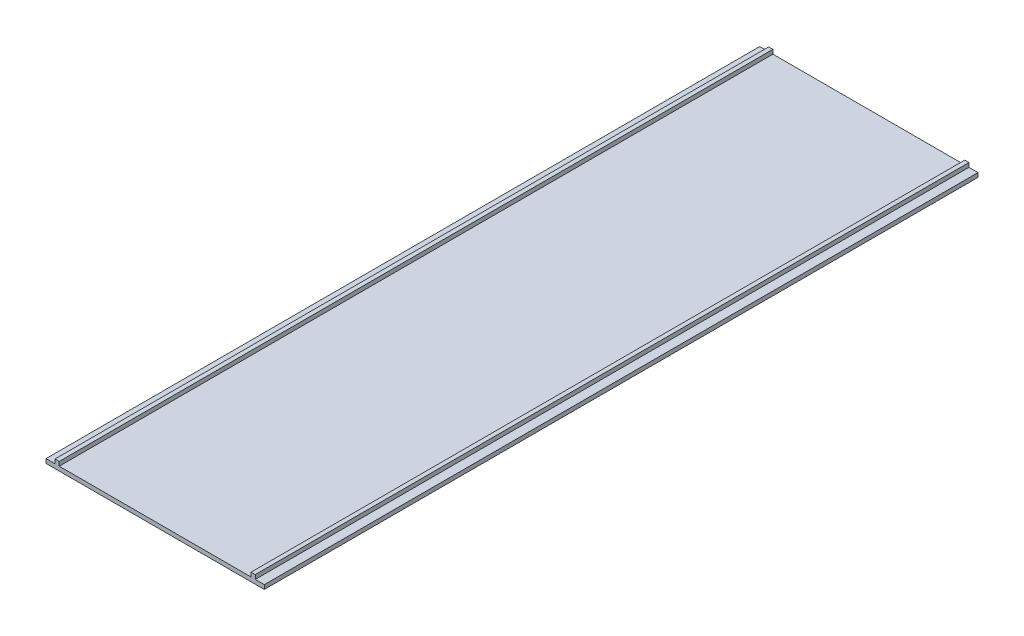
ISO-10303-21;
HEADER;
FILE_DESCRIPTION(('STEP AP214'),'2;1');
FILE_NAME('part.step','',(''),(''),'','','');
FILE_SCHEMA(('AUTOMOTIVE_DESIGN { 1 0 10303 214 1 1 1 1 }'));
ENDSEC;
DATA;
#1=APPLICATION_CONTEXT('core data for automotive mechanical design processes');
#2=APPLICATION_PROTOCOL_DEFINITION('international standard','automotive_design',2000,#1);
#3=PRODUCT_CONTEXT('',#1,'mechanical');
#4=PRODUCT('Part','Part','',(#3));
#5=PRODUCT_RELATED_PRODUCT_CATEGORY('part','',(#4));
#6=PRODUCT_DEFINITION_FORMATION('','',#4);
#7=PRODUCT_DEFINITION_CONTEXT('part definition',#1,'design');
#8=PRODUCT_DEFINITION('design','',#6,#7);
#9=PRODUCT_DEFINITION_SHAPE('','',#8);
#10=(LENGTH_UNIT() NAMED_UNIT(*) SI_UNIT(.MILLI.,.METRE.));
#11=(NAMED_UNIT(*) PLANE_ANGLE_UNIT() SI_UNIT($,.RADIAN.));
#12=(NAMED_UNIT(*) SI_UNIT($,.STERADIAN.) SOLID_ANGLE_UNIT());
#13=UNCERTAINTY_MEASURE_WITH_UNIT(LENGTH_MEASURE(1.E-05),#10,'distance_accuracy_value','');
#14=(GEOMETRIC_REPRESENTATION_CONTEXT(3) GLOBAL_UNCERTAINTY_ASSIGNED_CONTEXT((#13)) GLOBAL_UNIT_ASSIGNED_CONTEXT((#10,
#11,#12)) REPRESENTATION_CONTEXT('',''));
#15=CARTESIAN_POINT('',(0.,0.,0.));
#16=DIRECTION('',(0.,0.,1.));
#17=DIRECTION('',(1.,0.,0.));
#18=AXIS2_PLACEMENT_3D('',#15,#16,#17);
#19=CARTESIAN_POINT('',(0.,2.,0.));
#20=DIRECTION('',(0.,-1.,0.));
#21=DIRECTION('',(0.,0.,-1.));
#22=AXIS2_PLACEMENT_3D('',#19,#20,#21);
#23=PLANE('',#22);
#24=DIRECTION('',(0.,0.,1.));
#25=VECTOR('',#24,1.);
#26=CARTESIAN_POINT('',(47.7,2.,-172.828427124746));
#27=LINE('',#26,#25);
#28=CARTESIAN_POINT('',(47.7,2.,-170.));
#29=VERTEX_POINT('',#28);
#30=CARTESIAN_POINT('',(47.7,2.,170.));
#31=VERTEX_POINT('',#30);
#32=EDGE_CURVE('E50',#29,#31,#27,.T.);
#33=ORIENTED_EDGE('',*,*,#32,.T.);
#34=DIRECTION('',(1.,0.,0.));
#35=VECTOR('',#34,1.);
#36=CARTESIAN_POINT('',(-52.,2.,170.));
#37=LINE('',#36,#35);
#38=CARTESIAN_POINT('',(52.,2.,170.));
#39=VERTEX_POINT('',#38);
#40=EDGE_CURVE('E148',#31,#39,#37,.T.);
#41=ORIENTED_EDGE('',*,*,#40,.T.);
#42=DIRECTION('',(0.,0.,-1.));
#43=VECTOR('',#42,1.);
#44=CARTESIAN_POINT('',(52.,2.,170.));
#45=LINE('',#44,#43);
#46=CARTESIAN_POINT('',(52.,2.,-170.));
#47=VERTEX_POINT('',#46);
#48=EDGE_CURVE('E187',#39,#47,#45,.T.);
#49=ORIENTED_EDGE('',*,*,#48,.T.);
#50=DIRECTION('',(-1.,0.,0.));
#51=VECTOR('',#50,1.);
#52=CARTESIAN_POINT('',(-52.,2.,-170.));
#53=LINE('',#52,#51);
#54=EDGE_CURVE('E192',#47,#29,#53,.T.);
#55=ORIENTED_EDGE('',*,*,#54,.T.);
#56=EDGE_LOOP('',(#33,#41,#49,#55));
#57=FACE_BOUND('',#56,.T.);
#58=ADVANCED_FACE('F35',(#57),#23,.F.);
#59=DIRECTION('',(0.,0.,1.));
#60=VECTOR('',#59,1.);
#61=CARTESIAN_POINT('',(45.7,2.,-172.828427124746));
#62=LINE('',#61,#60);
#63=CARTESIAN_POINT('',(45.7,2.,-170.));
#64=VERTEX_POINT('',#63);
#65=CARTESIAN_POINT('',(45.7,2.,170.));
#66=VERTEX_POINT('',#65);
#67=EDGE_CURVE('E155',#64,#66,#62,.T.);
#68=ORIENTED_EDGE('',*,*,#67,.F.);
#69=CARTESIAN_POINT('',(-45.7,2.,-170.));
#70=VERTEX_POINT('',#69);
#71=EDGE_CURVE('E195',#64,#70,#53,.T.);
#72=ORIENTED_EDGE('',*,*,#71,.T.);
#73=DIRECTION('',(0.,0.,1.));
#74=VECTOR('',#73,1.);
#75=CARTESIAN_POINT('',(-45.7,2.,-172.828427124746));
#76=LINE('',#75,#74);
#77=CARTESIAN_POINT('',(-45.7,2.,170.));
#78=VERTEX_POINT('',#77);
#79=EDGE_CURVE('E176',#70,#78,#76,.T.);
#80=ORIENTED_EDGE('',*,*,#79,.T.);
#81=EDGE_CURVE('E58',#78,#66,#37,.T.);
#82=ORIENTED_EDGE('',*,*,#81,.T.);
#83=EDGE_LOOP('',(#68,#72,#80,#82));
#84=FACE_BOUND('',#83,.T.);
#85=ADVANCED_FACE('F249',(#84),#23,.F.);
#86=DIRECTION('',(0.,0.,1.));
#87=VECTOR('',#86,1.);
#88=CARTESIAN_POINT('',(-47.7,2.,-172.828427124746));
#89=LINE('',#88,#87);
#90=CARTESIAN_POINT('',(-47.7,2.,-170.));
#91=VERTEX_POINT('',#90);
#92=CARTESIAN_POINT('',(-47.7,2.,170.));
#93=VERTEX_POINT('',#92);
#94=EDGE_CURVE('E164',#91,#93,#89,.T.);
#95=ORIENTED_EDGE('',*,*,#94,.F.);
#96=CARTESIAN_POINT('',(-52.,2.,-170.));
#97=VERTEX_POINT('',#96);
#98=EDGE_CURVE('E190',#91,#97,#53,.T.);
#99=ORIENTED_EDGE('',*,*,#98,.T.);
#100=DIRECTION('',(0.,0.,1.));
#101=VECTOR('',#100,1.);
#102=CARTESIAN_POINT('',(-52.,2.,170.));
#103=LINE('',#102,#101);
#104=CARTESIAN_POINT('',(-52.,2.,170.));
#105=VERTEX_POINT('',#104);
#106=EDGE_CURVE('E194',#97,#105,#103,.T.);
#107=ORIENTED_EDGE('',*,*,#106,.T.);
#108=EDGE_CURVE('E197',#105,#93,#37,.T.);
#109=ORIENTED_EDGE('',*,*,#108,.T.);
#110=EDGE_LOOP('',(#95,#99,#107,#109));
#111=FACE_BOUND('',#110,.T.);
#112=ADVANCED_FACE('F248',(#111),#23,.F.);
#113=CARTESIAN_POINT('',(52.,2.,170.));
#114=DIRECTION('',(-1.,0.,0.));
#115=DIRECTION('',(0.,0.,1.));
#116=AXIS2_PLACEMENT_3D('',#113,#114,#115);
#117=PLANE('',#116);
#118=DIRECTION('',(0.,0.,-1.));
#119=VECTOR('',#118,1.);
#120=CARTESIAN_POINT('',(52.,0.,170.));
#121=LINE('',#120,#119);
#122=CARTESIAN_POINT('',(52.,0.,170.));
#123=VERTEX_POINT('',#122);
#124=CARTESIAN_POINT('',(52.,0.,-170.));
#125=VERTEX_POINT('',#124);
#126=EDGE_CURVE('E186',#123,#125,#121,.T.);
#127=ORIENTED_EDGE('',*,*,#126,.T.);
#128=DIRECTION('',(0.,-1.,0.));
#129=VECTOR('',#128,1.);
#130=CARTESIAN_POINT('',(52.,2.,-170.));
#131=LINE('',#130,#129);
#132=EDGE_CURVE('E11',#47,#125,#131,.T.);
#133=ORIENTED_EDGE('',*,*,#132,.F.);
#134=ORIENTED_EDGE('',*,*,#48,.F.);
#135=DIRECTION('',(0.,-1.,0.));
#136=VECTOR('',#135,1.);
#137=CARTESIAN_POINT('',(52.,2.,170.));
#138=LINE('',#137,#136);
#139=EDGE_CURVE('E199',#39,#123,#138,.T.);
#140=ORIENTED_EDGE('',*,*,#139,.T.);
#141=EDGE_LOOP('',(#127,#133,#134,#140));
#142=FACE_BOUND('',#141,.T.);
#143=ADVANCED_FACE('F37',(#142),#117,.F.);
#144=CARTESIAN_POINT('',(-52.,2.,-170.));
#145=DIRECTION('',(0.,0.,1.));
#146=DIRECTION('',(1.,0.,0.));
#147=AXIS2_PLACEMENT_3D('',#144,#145,#146);
#148=PLANE('',#147);
#149=DIRECTION('',(-1.,0.,0.));
#150=VECTOR('',#149,1.);
#151=CARTESIAN_POINT('',(-52.,0.,-170.));
#152=LINE('',#151,#150);
#153=CARTESIAN_POINT('',(-52.,0.,-170.));
#154=VERTEX_POINT('',#153);
#155=EDGE_CURVE('E202',#125,#154,#152,.T.);
#156=ORIENTED_EDGE('',*,*,#155,.T.);
#157=DIRECTION('',(0.,-1.,0.));
#158=VECTOR('',#157,1.);
#159=CARTESIAN_POINT('',(-52.,2.,-170.));
#160=LINE('',#159,#158);
#161=EDGE_CURVE('E43',#97,#154,#160,.T.);
#162=ORIENTED_EDGE('',*,*,#161,.F.);
#163=ORIENTED_EDGE('',*,*,#98,.F.);
#164=DIRECTION('',(0.,1.,0.));
#165=VECTOR('',#164,1.);
#166=CARTESIAN_POINT('',(-47.7,2.,-170.));
#167=LINE('',#166,#165);
#168=CARTESIAN_POINT('',(-47.7,4.,-170.));
#169=VERTEX_POINT('',#168);
#170=EDGE_CURVE('E163',#91,#169,#167,.T.);
#171=ORIENTED_EDGE('',*,*,#170,.T.);
#172=DIRECTION('',(1.,0.,0.));
#173=VECTOR('',#172,1.);
#174=CARTESIAN_POINT('',(-47.7,4.,-170.));
#175=LINE('',#174,#173);
#176=CARTESIAN_POINT('',(-45.7,4.,-170.));
#177=VERTEX_POINT('',#176);
#178=EDGE_CURVE('E161',#169,#177,#175,.T.);
#179=ORIENTED_EDGE('',*,*,#178,.T.);
#180=DIRECTION('',(0.,-1.,0.));
#181=VECTOR('',#180,1.);
#182=CARTESIAN_POINT('',(-45.7,4.,-170.));
#183=LINE('',#182,#181);
#184=EDGE_CURVE('E166',#177,#70,#183,.T.);
#185=ORIENTED_EDGE('',*,*,#184,.T.);
#186=ORIENTED_EDGE('',*,*,#71,.F.);
#187=DIRECTION('',(0.,-1.,0.));
#188=VECTOR('',#187,1.);
#189=CARTESIAN_POINT('',(45.7,4.,-170.));
#190=LINE('',#189,#188);
#191=CARTESIAN_POINT('',(45.7,4.,-170.));
#192=VERTEX_POINT('',#191);
#193=EDGE_CURVE('E151',#192,#64,#190,.T.);
#194=ORIENTED_EDGE('',*,*,#193,.F.);
#195=DIRECTION('',(-1.,0.,0.));
#196=VECTOR('',#195,1.);
#197=CARTESIAN_POINT('',(47.7,4.,-170.));
#198=LINE('',#197,#196);
#199=CARTESIAN_POINT('',(47.7,4.,-170.));
#200=VERTEX_POINT('',#199);
#201=EDGE_CURVE('E160',#200,#192,#198,.T.);
#202=ORIENTED_EDGE('',*,*,#201,.F.);
#203=DIRECTION('',(0.,1.,0.));
#204=VECTOR('',#203,1.);
#205=CARTESIAN_POINT('',(47.7,2.,-170.));
#206=LINE('',#205,#204);
#207=EDGE_CURVE('E132',#29,#200,#206,.T.);
#208=ORIENTED_EDGE('',*,*,#207,.F.);
#209=ORIENTED_EDGE('',*,*,#54,.F.);
#210=ORIENTED_EDGE('',*,*,#132,.T.);
#211=EDGE_LOOP('',(#156,#162,#163,#171,#179,#185,#186,#194,#202,#208,#209,#210));
#212=FACE_BOUND('',#211,.T.);
#213=ADVANCED_FACE('F228',(#212),#148,.F.);
#214=CARTESIAN_POINT('',(-52.,2.,170.));
#215=DIRECTION('',(1.,0.,0.));
#216=DIRECTION('',(0.,0.,-1.));
#217=AXIS2_PLACEMENT_3D('',#214,#215,#216);
#218=PLANE('',#217);
#219=DIRECTION('',(0.,0.,1.));
#220=VECTOR('',#219,1.);
#221=CARTESIAN_POINT('',(-52.,0.,170.));
#222=LINE('',#221,#220);
#223=CARTESIAN_POINT('',(-52.,0.,170.));
#224=VERTEX_POINT('',#223);
#225=EDGE_CURVE('E204',#154,#224,#222,.T.);
#226=ORIENTED_EDGE('',*,*,#225,.T.);
#227=DIRECTION('',(0.,-1.,0.));
#228=VECTOR('',#227,1.);
#229=CARTESIAN_POINT('',(-52.,2.,170.));
#230=LINE('',#229,#228);
#231=EDGE_CURVE('E209',#105,#224,#230,.T.);
#232=ORIENTED_EDGE('',*,*,#231,.F.);
#233=ORIENTED_EDGE('',*,*,#106,.F.);
#234=ORIENTED_EDGE('',*,*,#161,.T.);
#235=EDGE_LOOP('',(#226,#232,#233,#234));
#236=FACE_BOUND('',#235,.T.);
#237=ADVANCED_FACE('F216',(#236),#218,.F.);
#238=CARTESIAN_POINT('',(-52.,2.,170.));
#239=DIRECTION('',(0.,0.,-1.));
#240=DIRECTION('',(-1.,0.,0.));
#241=AXIS2_PLACEMENT_3D('',#238,#239,#240);
#242=PLANE('',#241);
#243=DIRECTION('',(1.,0.,0.));
#244=VECTOR('',#243,1.);
#245=CARTESIAN_POINT('',(-52.,0.,170.));
#246=LINE('',#245,#244);
#247=EDGE_CURVE('E191',#224,#123,#246,.T.);
#248=ORIENTED_EDGE('',*,*,#247,.T.);
#249=ORIENTED_EDGE('',*,*,#139,.F.);
#250=ORIENTED_EDGE('',*,*,#40,.F.);
#251=DIRECTION('',(0.,-1.,0.));
#252=VECTOR('',#251,1.);
#253=CARTESIAN_POINT('',(47.7,2.,170.));
#254=LINE('',#253,#252);
#255=CARTESIAN_POINT('',(47.7,4.,170.));
#256=VERTEX_POINT('',#255);
#257=EDGE_CURVE('E130',#256,#31,#254,.T.);
#258=ORIENTED_EDGE('',*,*,#257,.F.);
#259=DIRECTION('',(1.,0.,0.));
#260=VECTOR('',#259,1.);
#261=CARTESIAN_POINT('',(47.7,4.,170.));
#262=LINE('',#261,#260);
#263=CARTESIAN_POINT('',(45.7,4.,170.));
#264=VERTEX_POINT('',#263);
#265=EDGE_CURVE('E138',#264,#256,#262,.T.);
#266=ORIENTED_EDGE('',*,*,#265,.F.);
#267=DIRECTION('',(0.,1.,0.));
#268=VECTOR('',#267,1.);
#269=CARTESIAN_POINT('',(45.7,4.,170.));
#270=LINE('',#269,#268);
#271=EDGE_CURVE('E144',#66,#264,#270,.T.);
#272=ORIENTED_EDGE('',*,*,#271,.F.);
#273=ORIENTED_EDGE('',*,*,#81,.F.);
#274=DIRECTION('',(0.,1.,0.));
#275=VECTOR('',#274,1.);
#276=CARTESIAN_POINT('',(-45.7,4.,170.));
#277=LINE('',#276,#275);
#278=CARTESIAN_POINT('',(-45.7,4.,170.));
#279=VERTEX_POINT('',#278);
#280=EDGE_CURVE('E167',#78,#279,#277,.T.);
#281=ORIENTED_EDGE('',*,*,#280,.T.);
#282=DIRECTION('',(-1.,0.,0.));
#283=VECTOR('',#282,1.);
#284=CARTESIAN_POINT('',(-47.7,4.,170.));
#285=LINE('',#284,#283);
#286=CARTESIAN_POINT('',(-47.7,4.,170.));
#287=VERTEX_POINT('',#286);
#288=EDGE_CURVE('E170',#279,#287,#285,.T.);
#289=ORIENTED_EDGE('',*,*,#288,.T.);
#290=DIRECTION('',(0.,-1.,0.));
#291=VECTOR('',#290,1.);
#292=CARTESIAN_POINT('',(-47.7,2.,170.));
#293=LINE('',#292,#291);
#294=EDGE_CURVE('E173',#287,#93,#293,.T.);
#295=ORIENTED_EDGE('',*,*,#294,.T.);
#296=ORIENTED_EDGE('',*,*,#108,.F.);
#297=ORIENTED_EDGE('',*,*,#231,.T.);
#298=EDGE_LOOP('',(#248,#249,#250,#258,#266,#272,#273,#281,#289,#295,#296,#297));
#299=FACE_BOUND('',#298,.T.);
#300=ADVANCED_FACE('F146',(#299),#242,.F.);
#301=CARTESIAN_POINT('',(0.,0.,0.));
#302=DIRECTION('',(0.,-1.,0.));
#303=DIRECTION('',(0.,0.,-1.));
#304=AXIS2_PLACEMENT_3D('',#301,#302,#303);
#305=PLANE('',#304);
#306=ORIENTED_EDGE('',*,*,#126,.F.);
#307=ORIENTED_EDGE('',*,*,#247,.F.);
#308=ORIENTED_EDGE('',*,*,#225,.F.);
#309=ORIENTED_EDGE('',*,*,#155,.F.);
#310=EDGE_LOOP('',(#306,#307,#308,#309));
#311=FACE_BOUND('',#310,.T.);
#312=ADVANCED_FACE('F223',(#311),#305,.T.);
#313=CARTESIAN_POINT('',(-47.7,2.,-172.828427124746));
#314=DIRECTION('',(-1.,0.,0.));
#315=DIRECTION('',(0.,0.,1.));
#316=AXIS2_PLACEMENT_3D('',#313,#314,#315);
#317=PLANE('',#316);
#318=ORIENTED_EDGE('',*,*,#170,.F.);
#319=ORIENTED_EDGE('',*,*,#94,.T.);
#320=ORIENTED_EDGE('',*,*,#294,.F.);
#321=DIRECTION('',(0.,0.,1.));
#322=VECTOR('',#321,1.);
#323=CARTESIAN_POINT('',(-47.7,4.,-172.828427124746));
#324=LINE('',#323,#322);
#325=EDGE_CURVE('E179',#169,#287,#324,.T.);
#326=ORIENTED_EDGE('',*,*,#325,.F.);
#327=EDGE_LOOP('',(#318,#319,#320,#326));
#328=FACE_BOUND('',#327,.T.);
#329=ADVANCED_FACE('F246',(#328),#317,.T.);
#330=CARTESIAN_POINT('',(-47.7,4.,-172.828427124746));
#331=DIRECTION('',(0.,1.,0.));
#332=DIRECTION('',(0.,0.,1.));
#333=AXIS2_PLACEMENT_3D('',#330,#331,#332);
#334=PLANE('',#333);
#335=ORIENTED_EDGE('',*,*,#178,.F.);
#336=ORIENTED_EDGE('',*,*,#325,.T.);
#337=ORIENTED_EDGE('',*,*,#288,.F.);
#338=DIRECTION('',(0.,0.,1.));
#339=VECTOR('',#338,1.);
#340=CARTESIAN_POINT('',(-45.7,4.,-172.828427124746));
#341=LINE('',#340,#339);
#342=EDGE_CURVE('E181',#177,#279,#341,.T.);
#343=ORIENTED_EDGE('',*,*,#342,.F.);
#344=EDGE_LOOP('',(#335,#336,#337,#343));
#345=FACE_BOUND('',#344,.T.);
#346=ADVANCED_FACE('F241',(#345),#334,.T.);
#347=CARTESIAN_POINT('',(-45.7,4.,-172.828427124746));
#348=DIRECTION('',(1.,0.,0.));
#349=DIRECTION('',(0.,0.,-1.));
#350=AXIS2_PLACEMENT_3D('',#347,#348,#349);
#351=PLANE('',#350);
#352=ORIENTED_EDGE('',*,*,#184,.F.);
#353=ORIENTED_EDGE('',*,*,#342,.T.);
#354=ORIENTED_EDGE('',*,*,#280,.F.);
#355=ORIENTED_EDGE('',*,*,#79,.F.);
#356=EDGE_LOOP('',(#352,#353,#354,#355));
#357=FACE_BOUND('',#356,.T.);
#358=ADVANCED_FACE('F236',(#357),#351,.T.);
#359=CARTESIAN_POINT('',(47.7,2.,-172.828427124746));
#360=DIRECTION('',(-1.,0.,0.));
#361=DIRECTION('',(0.,0.,1.));
#362=AXIS2_PLACEMENT_3D('',#359,#360,#361);
#363=PLANE('',#362);
#364=ORIENTED_EDGE('',*,*,#32,.F.);
#365=ORIENTED_EDGE('',*,*,#207,.T.);
#366=DIRECTION('',(0.,0.,1.));
#367=VECTOR('',#366,1.);
#368=CARTESIAN_POINT('',(47.7,4.,-172.828427124746));
#369=LINE('',#368,#367);
#370=EDGE_CURVE('E126',#200,#256,#369,.T.);
#371=ORIENTED_EDGE('',*,*,#370,.T.);
#372=ORIENTED_EDGE('',*,*,#257,.T.);
#373=EDGE_LOOP('',(#364,#365,#371,#372));
#374=FACE_BOUND('',#373,.T.);
#375=ADVANCED_FACE('F128',(#374),#363,.F.);
#376=CARTESIAN_POINT('',(47.7,4.,-172.828427124746));
#377=DIRECTION('',(0.,-1.,0.));
#378=DIRECTION('',(0.,0.,-1.));
#379=AXIS2_PLACEMENT_3D('',#376,#377,#378);
#380=PLANE('',#379);
#381=ORIENTED_EDGE('',*,*,#370,.F.);
#382=ORIENTED_EDGE('',*,*,#201,.T.);
#383=DIRECTION('',(0.,0.,1.));
#384=VECTOR('',#383,1.);
#385=CARTESIAN_POINT('',(45.7,4.,-172.828427124746));
#386=LINE('',#385,#384);
#387=EDGE_CURVE('E135',#192,#264,#386,.T.);
#388=ORIENTED_EDGE('',*,*,#387,.T.);
#389=ORIENTED_EDGE('',*,*,#265,.T.);
#390=EDGE_LOOP('',(#381,#382,#388,#389));
#391=FACE_BOUND('',#390,.T.);
#392=ADVANCED_FACE('F139',(#391),#380,.F.);
#393=CARTESIAN_POINT('',(45.7,4.,-172.828427124746));
#394=DIRECTION('',(1.,0.,0.));
#395=DIRECTION('',(0.,0.,-1.));
#396=AXIS2_PLACEMENT_3D('',#393,#394,#395);
#397=PLANE('',#396);
#398=ORIENTED_EDGE('',*,*,#387,.F.);
#399=ORIENTED_EDGE('',*,*,#193,.T.);
#400=ORIENTED_EDGE('',*,*,#67,.T.);
#401=ORIENTED_EDGE('',*,*,#271,.T.);
#402=EDGE_LOOP('',(#398,#399,#400,#401));
#403=FACE_BOUND('',#402,.T.);
#404=ADVANCED_FACE('F231',(#403),#397,.F.);
#405=CLOSED_SHELL('',(#58,#85,#112,#143,#213,#237,#300,#312,#329,#346,#358,#375,#392,#404));
#406=MANIFOLD_SOLID_BREP('B2',#405);
#407=ADVANCED_BREP_SHAPE_REPRESENTATION('',(#18,#406),#14);
#408=SHAPE_DEFINITION_REPRESENTATION(#9,#407);
ENDSEC;
END-ISO-10303-21;
